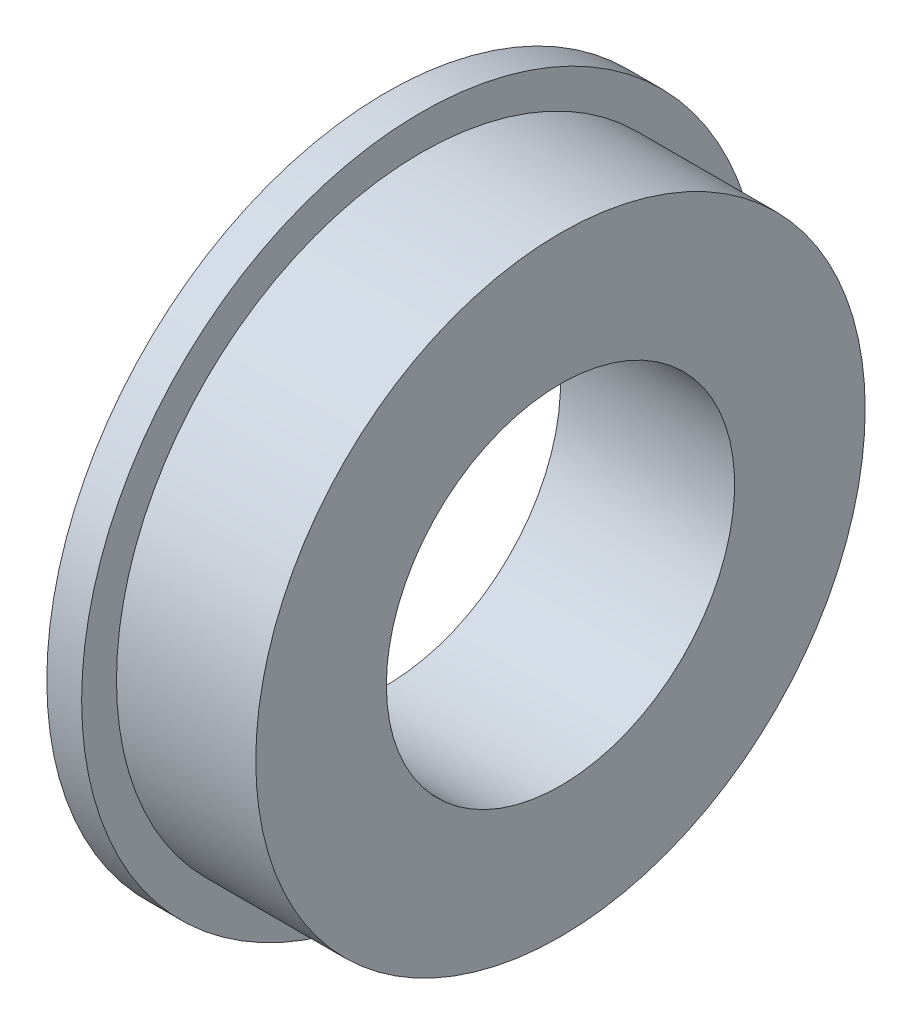
ISO-10303-21;
HEADER;
FILE_DESCRIPTION(('STEP AP214'),'2;1');
FILE_NAME('part.step','',(''),(''),'','','');
FILE_SCHEMA(('AUTOMOTIVE_DESIGN { 1 0 10303 214 1 1 1 1 }'));
ENDSEC;
DATA;
#1=APPLICATION_CONTEXT('core data for automotive mechanical design processes');
#2=APPLICATION_PROTOCOL_DEFINITION('international standard','automotive_design',2000,#1);
#3=PRODUCT_CONTEXT('',#1,'mechanical');
#4=PRODUCT('Part','Part','',(#3));
#5=PRODUCT_RELATED_PRODUCT_CATEGORY('part','',(#4));
#6=PRODUCT_DEFINITION_FORMATION('','',#4);
#7=PRODUCT_DEFINITION_CONTEXT('part definition',#1,'design');
#8=PRODUCT_DEFINITION('design','',#6,#7);
#9=PRODUCT_DEFINITION_SHAPE('','',#8);
#10=(LENGTH_UNIT() NAMED_UNIT(*) SI_UNIT(.MILLI.,.METRE.));
#11=(NAMED_UNIT(*) PLANE_ANGLE_UNIT() SI_UNIT($,.RADIAN.));
#12=(NAMED_UNIT(*) SI_UNIT($,.STERADIAN.) SOLID_ANGLE_UNIT());
#13=UNCERTAINTY_MEASURE_WITH_UNIT(LENGTH_MEASURE(1.E-05),#10,'distance_accuracy_value','');
#14=(GEOMETRIC_REPRESENTATION_CONTEXT(3) GLOBAL_UNCERTAINTY_ASSIGNED_CONTEXT((#13)) GLOBAL_UNIT_ASSIGNED_CONTEXT((#10,
#11,#12)) REPRESENTATION_CONTEXT('',''));
#15=CARTESIAN_POINT('',(0.,0.,0.));
#16=DIRECTION('',(0.,0.,1.));
#17=DIRECTION('',(1.,0.,0.));
#18=AXIS2_PLACEMENT_3D('',#15,#16,#17);
#19=CARTESIAN_POINT('',(0.,0.,0.));
#20=DIRECTION('',(-1.,0.,0.));
#21=DIRECTION('',(0.,0.,1.));
#22=AXIS2_PLACEMENT_3D('',#19,#20,#21);
#23=CYLINDRICAL_SURFACE('',#22,4.);
#24=CARTESIAN_POINT('',(4.,0.,0.));
#25=DIRECTION('',(-1.,0.,0.));
#26=DIRECTION('',(0.,0.,1.));
#27=AXIS2_PLACEMENT_3D('',#24,#25,#26);
#28=CIRCLE('',#27,4.);
#29=CARTESIAN_POINT('',(4.,0.,4.));
#30=VERTEX_POINT('',#29);
#31=EDGE_CURVE('E68',#30,#30,#28,.T.);
#32=ORIENTED_EDGE('',*,*,#31,.F.);
#33=EDGE_LOOP('',(#32));
#34=FACE_BOUND('',#33,.T.);
#35=CARTESIAN_POINT('',(0.,0.,0.));
#36=DIRECTION('',(-1.,0.,0.));
#37=DIRECTION('',(0.,0.,1.));
#38=AXIS2_PLACEMENT_3D('',#35,#36,#37);
#39=CIRCLE('',#38,4.);
#40=CARTESIAN_POINT('',(0.,0.,4.));
#41=VERTEX_POINT('',#40);
#42=EDGE_CURVE('E10',#41,#41,#39,.T.);
#43=ORIENTED_EDGE('',*,*,#42,.T.);
#44=EDGE_LOOP('',(#43));
#45=FACE_BOUND('',#44,.T.);
#46=ADVANCED_FACE('F41',(#34,#45),#23,.F.);
#47=CARTESIAN_POINT('',(0.,4.,0.));
#48=DIRECTION('',(1.,0.,0.));
#49=DIRECTION('',(0.,0.,-1.));
#50=AXIS2_PLACEMENT_3D('',#47,#48,#49);
#51=PLANE('',#50);
#52=ORIENTED_EDGE('',*,*,#42,.F.);
#53=EDGE_LOOP('',(#52));
#54=FACE_BOUND('',#53,.T.);
#55=CARTESIAN_POINT('',(0.,0.,0.));
#56=DIRECTION('',(-1.,0.,0.));
#57=DIRECTION('',(0.,0.,1.));
#58=AXIS2_PLACEMENT_3D('',#55,#56,#57);
#59=CIRCLE('',#58,7.8);
#60=CARTESIAN_POINT('',(0.,0.,7.8));
#61=VERTEX_POINT('',#60);
#62=EDGE_CURVE('E48',#61,#61,#59,.T.);
#63=ORIENTED_EDGE('',*,*,#62,.T.);
#64=EDGE_LOOP('',(#63));
#65=FACE_BOUND('',#64,.T.);
#66=ADVANCED_FACE('F76',(#54,#65),#51,.F.);
#67=CARTESIAN_POINT('',(0.,0.,0.));
#68=DIRECTION('',(-1.,0.,0.));
#69=DIRECTION('',(0.,0.,1.));
#70=AXIS2_PLACEMENT_3D('',#67,#68,#69);
#71=CYLINDRICAL_SURFACE('',#70,7.8);
#72=ORIENTED_EDGE('',*,*,#62,.F.);
#73=EDGE_LOOP('',(#72));
#74=FACE_BOUND('',#73,.T.);
#75=CARTESIAN_POINT('',(0.8,0.,0.));
#76=DIRECTION('',(-1.,0.,0.));
#77=DIRECTION('',(0.,0.,1.));
#78=AXIS2_PLACEMENT_3D('',#75,#76,#77);
#79=CIRCLE('',#78,7.8);
#80=CARTESIAN_POINT('',(0.8,0.,7.8));
#81=VERTEX_POINT('',#80);
#82=EDGE_CURVE('E53',#81,#81,#79,.T.);
#83=ORIENTED_EDGE('',*,*,#82,.T.);
#84=EDGE_LOOP('',(#83));
#85=FACE_BOUND('',#84,.T.);
#86=ADVANCED_FACE('F80',(#74,#85),#71,.T.);
#87=CARTESIAN_POINT('',(0.8,7.8,0.));
#88=DIRECTION('',(-1.,0.,0.));
#89=DIRECTION('',(0.,0.,1.));
#90=AXIS2_PLACEMENT_3D('',#87,#88,#89);
#91=PLANE('',#90);
#92=ORIENTED_EDGE('',*,*,#82,.F.);
#93=EDGE_LOOP('',(#92));
#94=FACE_BOUND('',#93,.T.);
#95=CARTESIAN_POINT('',(0.8,0.,0.));
#96=DIRECTION('',(-1.,0.,0.));
#97=DIRECTION('',(0.,0.,1.));
#98=AXIS2_PLACEMENT_3D('',#95,#96,#97);
#99=CIRCLE('',#98,7.);
#100=CARTESIAN_POINT('',(0.8,0.,7.));
#101=VERTEX_POINT('',#100);
#102=EDGE_CURVE('E58',#101,#101,#99,.T.);
#103=ORIENTED_EDGE('',*,*,#102,.T.);
#104=EDGE_LOOP('',(#103));
#105=FACE_BOUND('',#104,.T.);
#106=ADVANCED_FACE('F85',(#94,#105),#91,.F.);
#107=CARTESIAN_POINT('',(0.,0.,0.));
#108=DIRECTION('',(-1.,0.,0.));
#109=DIRECTION('',(0.,0.,1.));
#110=AXIS2_PLACEMENT_3D('',#107,#108,#109);
#111=CYLINDRICAL_SURFACE('',#110,7.);
#112=ORIENTED_EDGE('',*,*,#102,.F.);
#113=EDGE_LOOP('',(#112));
#114=FACE_BOUND('',#113,.T.);
#115=CARTESIAN_POINT('',(4.,0.,0.));
#116=DIRECTION('',(-1.,0.,0.));
#117=DIRECTION('',(0.,0.,1.));
#118=AXIS2_PLACEMENT_3D('',#115,#116,#117);
#119=CIRCLE('',#118,7.);
#120=CARTESIAN_POINT('',(4.,0.,7.));
#121=VERTEX_POINT('',#120);
#122=EDGE_CURVE('E64',#121,#121,#119,.T.);
#123=ORIENTED_EDGE('',*,*,#122,.T.);
#124=EDGE_LOOP('',(#123));
#125=FACE_BOUND('',#124,.T.);
#126=ADVANCED_FACE('F91',(#114,#125),#111,.T.);
#127=CARTESIAN_POINT('',(4.,7.,0.));
#128=DIRECTION('',(-1.,0.,0.));
#129=DIRECTION('',(0.,0.,1.));
#130=AXIS2_PLACEMENT_3D('',#127,#128,#129);
#131=PLANE('',#130);
#132=ORIENTED_EDGE('',*,*,#122,.F.);
#133=EDGE_LOOP('',(#132));
#134=FACE_BOUND('',#133,.T.);
#135=ORIENTED_EDGE('',*,*,#31,.T.);
#136=EDGE_LOOP('',(#135));
#137=FACE_BOUND('',#136,.T.);
#138=ADVANCED_FACE('F73',(#134,#137),#131,.F.);
#139=CLOSED_SHELL('',(#46,#66,#86,#106,#126,#138));
#140=MANIFOLD_SOLID_BREP('B2',#139);
#141=ADVANCED_BREP_SHAPE_REPRESENTATION('',(#18,#140),#14);
#142=SHAPE_DEFINITION_REPRESENTATION(#9,#141);
ENDSEC;
END-ISO-10303-21;
